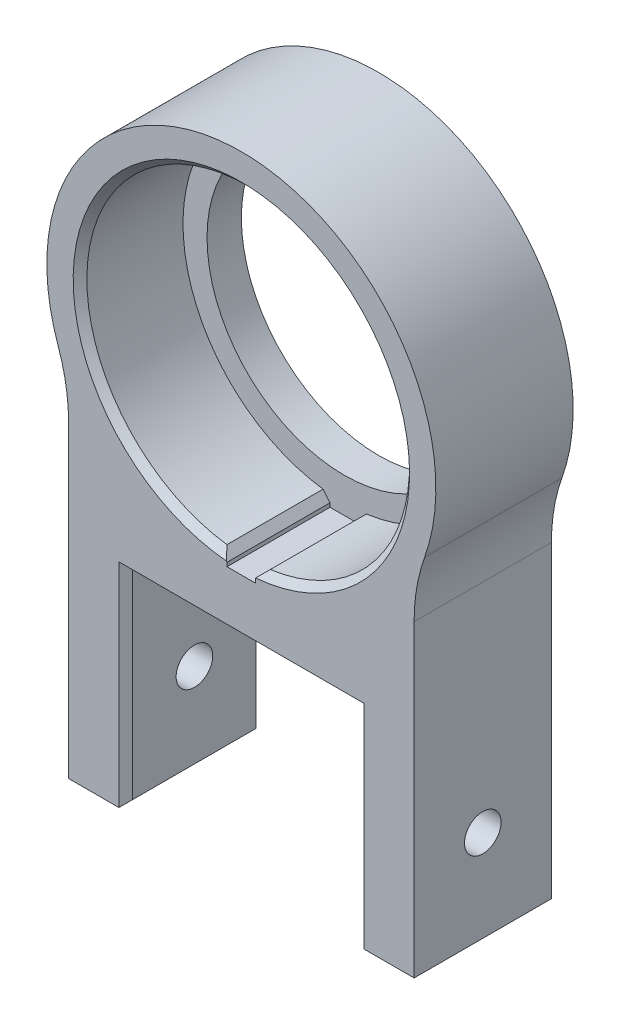
ISO-10303-21;
HEADER;
FILE_DESCRIPTION(('STEP AP214'),'2;1');
FILE_NAME('part.step','',(''),(''),'','','');
FILE_SCHEMA(('AUTOMOTIVE_DESIGN { 1 0 10303 214 1 1 1 1 }'));
ENDSEC;
DATA;
#1=APPLICATION_CONTEXT('core data for automotive mechanical design processes');
#2=APPLICATION_PROTOCOL_DEFINITION('international standard','automotive_design',2000,#1);
#3=PRODUCT_CONTEXT('',#1,'mechanical');
#4=PRODUCT('Part','Part','',(#3));
#5=PRODUCT_RELATED_PRODUCT_CATEGORY('part','',(#4));
#6=PRODUCT_DEFINITION_FORMATION('','',#4);
#7=PRODUCT_DEFINITION_CONTEXT('part definition',#1,'design');
#8=PRODUCT_DEFINITION('design','',#6,#7);
#9=PRODUCT_DEFINITION_SHAPE('','',#8);
#10=(LENGTH_UNIT() NAMED_UNIT(*) SI_UNIT(.MILLI.,.METRE.));
#11=(NAMED_UNIT(*) PLANE_ANGLE_UNIT() SI_UNIT($,.RADIAN.));
#12=(NAMED_UNIT(*) SI_UNIT($,.STERADIAN.) SOLID_ANGLE_UNIT());
#13=UNCERTAINTY_MEASURE_WITH_UNIT(LENGTH_MEASURE(1.E-05),#10,'distance_accuracy_value','');
#14=(GEOMETRIC_REPRESENTATION_CONTEXT(3) GLOBAL_UNCERTAINTY_ASSIGNED_CONTEXT((#13)) GLOBAL_UNIT_ASSIGNED_CONTEXT((#10,
#11,#12)) REPRESENTATION_CONTEXT('',''));
#15=CARTESIAN_POINT('',(0.,0.,0.));
#16=DIRECTION('',(0.,0.,1.));
#17=DIRECTION('',(1.,0.,0.));
#18=AXIS2_PLACEMENT_3D('',#15,#16,#17);
#19=CARTESIAN_POINT('',(-31.0633254055535,-11.0295347381974,12.));
#20=DIRECTION('',(0.,0.,-1.));
#21=DIRECTION('',(-1.,0.,0.));
#22=AXIS2_PLACEMENT_3D('',#19,#20,#21);
#23=PLANE('',#22);
#24=DIRECTION('',(0.,-1.,0.));
#25=VECTOR('',#24,1.);
#26=CARTESIAN_POINT('',(-1.25,-15.0444829025493,12.));
#27=LINE('',#26,#25);
#28=CARTESIAN_POINT('',(-1.25,-14.7057054048135,12.));
#29=VERTEX_POINT('',#28);
#30=CARTESIAN_POINT('',(-1.25,-15.0444829025493,12.));
#31=VERTEX_POINT('',#30);
#32=EDGE_CURVE('E212',#29,#31,#27,.T.);
#33=ORIENTED_EDGE('',*,*,#32,.F.);
#34=DIRECTION('',(0.641635859728227,-0.767009402491795,0.));
#35=VECTOR('',#34,1.);
#36=CARTESIAN_POINT('',(-1.25,-14.7057054048135,12.));
#37=LINE('',#36,#35);
#38=CARTESIAN_POINT('',(-1.30319148936173,-14.6421204728705,12.));
#39=VERTEX_POINT('',#38);
#40=EDGE_CURVE('E346',#29,#39,#37,.F.);
#41=ORIENTED_EDGE('',*,*,#40,.T.);
#42=CARTESIAN_POINT('',(0.,0.,12.));
#43=DIRECTION('',(0.,0.,-1.));
#44=DIRECTION('',(-1.,0.,0.));
#45=AXIS2_PLACEMENT_3D('',#42,#43,#44);
#46=CIRCLE('',#45,14.7);
#47=CARTESIAN_POINT('',(1.25,-14.6467573203081,12.));
#48=VERTEX_POINT('',#47);
#49=EDGE_CURVE('E216',#39,#48,#46,.T.);
#50=ORIENTED_EDGE('',*,*,#49,.T.);
#51=DIRECTION('',(0.,1.,0.));
#52=VECTOR('',#51,1.);
#53=CARTESIAN_POINT('',(1.25,-15.0444829025493,12.));
#54=LINE('',#53,#52);
#55=CARTESIAN_POINT('',(1.25,-15.0444829025493,12.));
#56=VERTEX_POINT('',#55);
#57=EDGE_CURVE('E192',#56,#48,#54,.T.);
#58=ORIENTED_EDGE('',*,*,#57,.F.);
#59=DIRECTION('',(1.,0.,0.));
#60=VECTOR('',#59,1.);
#61=CARTESIAN_POINT('',(-1.25,-15.0444829025493,12.));
#62=LINE('',#61,#60);
#63=EDGE_CURVE('E204',#31,#56,#62,.T.);
#64=ORIENTED_EDGE('',*,*,#63,.F.);
#65=EDGE_LOOP('',(#33,#41,#50,#58,#64));
#66=FACE_BOUND('',#65,.T.);
#67=DIRECTION('',(1.,0.,0.));
#68=VECTOR('',#67,1.);
#69=CARTESIAN_POINT('',(-15.1,-38.,12.));
#70=LINE('',#69,#68);
#71=CARTESIAN_POINT('',(-15.1,-38.,12.));
#72=VERTEX_POINT('',#71);
#73=CARTESIAN_POINT('',(-10.7,-38.,12.));
#74=VERTEX_POINT('',#73);
#75=EDGE_CURVE('E266',#72,#74,#70,.T.);
#76=ORIENTED_EDGE('',*,*,#75,.T.);
#77=DIRECTION('',(0.,1.,0.));
#78=VECTOR('',#77,1.);
#79=CARTESIAN_POINT('',(-10.7,-11.0295347381974,12.));
#80=LINE('',#79,#78);
#81=CARTESIAN_POINT('',(-10.7,-19.4,12.));
#82=VERTEX_POINT('',#81);
#83=EDGE_CURVE('E355',#74,#82,#80,.T.);
#84=ORIENTED_EDGE('',*,*,#83,.T.);
#85=DIRECTION('',(1.,0.,0.));
#86=VECTOR('',#85,1.);
#87=CARTESIAN_POINT('',(-31.0633254055535,-19.4,12.));
#88=LINE('',#87,#86);
#89=CARTESIAN_POINT('',(10.7,-19.4,12.));
#90=VERTEX_POINT('',#89);
#91=EDGE_CURVE('E352',#82,#90,#88,.T.);
#92=ORIENTED_EDGE('',*,*,#91,.T.);
#93=DIRECTION('',(0.,-1.,0.));
#94=VECTOR('',#93,1.);
#95=CARTESIAN_POINT('',(10.7,-11.0295347381974,12.));
#96=LINE('',#95,#94);
#97=CARTESIAN_POINT('',(10.7,-38.,12.));
#98=VERTEX_POINT('',#97);
#99=EDGE_CURVE('E349',#90,#98,#96,.T.);
#100=ORIENTED_EDGE('',*,*,#99,.T.);
#101=DIRECTION('',(1.,0.,0.));
#102=VECTOR('',#101,1.);
#103=CARTESIAN_POINT('',(10.1,-38.,12.));
#104=LINE('',#103,#102);
#105=CARTESIAN_POINT('',(15.1,-38.,12.));
#106=VERTEX_POINT('',#105);
#107=EDGE_CURVE('E270',#98,#106,#104,.T.);
#108=ORIENTED_EDGE('',*,*,#107,.T.);
#109=DIRECTION('',(0.,1.,0.));
#110=VECTOR('',#109,1.);
#111=CARTESIAN_POINT('',(15.1,-38.,12.));
#112=LINE('',#111,#110);
#113=CARTESIAN_POINT('',(15.1,-11.0295347381974,12.));
#114=VERTEX_POINT('',#113);
#115=EDGE_CURVE('E273',#106,#114,#112,.T.);
#116=ORIENTED_EDGE('',*,*,#115,.T.);
#117=CARTESIAN_POINT('',(31.0633254055536,-11.0295347381974,12.));
#118=DIRECTION('',(0.,0.,-1.));
#119=DIRECTION('',(-1.,0.,0.));
#120=AXIS2_PLACEMENT_3D('',#117,#118,#119);
#121=CIRCLE('',#120,15.9633254055536);
#122=CARTESIAN_POINT('',(16.020123133737,-5.68820312400177,12.));
#123=VERTEX_POINT('',#122);
#124=EDGE_CURVE('E276',#114,#123,#121,.T.);
#125=ORIENTED_EDGE('',*,*,#124,.T.);
#126=CARTESIAN_POINT('',(0.,0.,12.));
#127=DIRECTION('',(0.,0.,1.));
#128=DIRECTION('',(-1.,0.,0.));
#129=AXIS2_PLACEMENT_3D('',#126,#127,#128);
#130=CIRCLE('',#129,17.);
#131=CARTESIAN_POINT('',(-16.020123133737,-5.68820312400176,12.));
#132=VERTEX_POINT('',#131);
#133=EDGE_CURVE('E279',#123,#132,#130,.T.);
#134=ORIENTED_EDGE('',*,*,#133,.T.);
#135=CARTESIAN_POINT('',(-31.0633254055535,-11.0295347381974,12.));
#136=DIRECTION('',(0.,0.,-1.));
#137=DIRECTION('',(-1.,0.,0.));
#138=AXIS2_PLACEMENT_3D('',#135,#136,#137);
#139=CIRCLE('',#138,15.9633254055535);
#140=CARTESIAN_POINT('',(-15.1,-11.0295347381974,12.));
#141=VERTEX_POINT('',#140);
#142=EDGE_CURVE('E258',#132,#141,#139,.T.);
#143=ORIENTED_EDGE('',*,*,#142,.T.);
#144=DIRECTION('',(0.,-1.,0.));
#145=VECTOR('',#144,1.);
#146=CARTESIAN_POINT('',(-15.1,-38.,12.));
#147=LINE('',#146,#145);
#148=EDGE_CURVE('E262',#141,#72,#147,.T.);
#149=ORIENTED_EDGE('',*,*,#148,.T.);
#150=EDGE_LOOP('',(#76,#84,#92,#100,#108,#116,#125,#134,#143,#149));
#151=FACE_BOUND('',#150,.T.);
#152=ADVANCED_FACE('F43',(#66,#151),#23,.F.);
#153=CARTESIAN_POINT('',(-31.0633254055535,-11.0295347381974,0.));
#154=DIRECTION('',(0.,0.,-1.));
#155=DIRECTION('',(-1.,0.,0.));
#156=AXIS2_PLACEMENT_3D('',#153,#154,#155);
#157=PLANE('',#156);
#158=CARTESIAN_POINT('',(0.,0.,0.));
#159=DIRECTION('',(0.,0.,1.));
#160=DIRECTION('',(1.,0.,0.));
#161=AXIS2_PLACEMENT_3D('',#158,#159,#160);
#162=CIRCLE('',#161,12.);
#163=CARTESIAN_POINT('',(12.,0.,0.));
#164=VERTEX_POINT('',#163);
#165=EDGE_CURVE('E253',#164,#164,#162,.T.);
#166=ORIENTED_EDGE('',*,*,#165,.T.);
#167=EDGE_LOOP('',(#166));
#168=FACE_BOUND('',#167,.T.);
#169=DIRECTION('',(-1.,0.,0.));
#170=VECTOR('',#169,1.);
#171=CARTESIAN_POINT('',(-10.1,-19.4,0.));
#172=LINE('',#171,#170);
#173=CARTESIAN_POINT('',(10.7,-19.4,0.));
#174=VERTEX_POINT('',#173);
#175=CARTESIAN_POINT('',(-10.7,-19.4,0.));
#176=VERTEX_POINT('',#175);
#177=EDGE_CURVE('E627',#174,#176,#172,.T.);
#178=ORIENTED_EDGE('',*,*,#177,.T.);
#179=DIRECTION('',(0.,-1.,0.));
#180=VECTOR('',#179,1.);
#181=CARTESIAN_POINT('',(-10.7,-38.,0.));
#182=LINE('',#181,#180);
#183=CARTESIAN_POINT('',(-10.7,-38.,0.));
#184=VERTEX_POINT('',#183);
#185=EDGE_CURVE('E608',#176,#184,#182,.T.);
#186=ORIENTED_EDGE('',*,*,#185,.T.);
#187=DIRECTION('',(1.,0.,0.));
#188=VECTOR('',#187,1.);
#189=CARTESIAN_POINT('',(-15.1,-38.,0.));
#190=LINE('',#189,#188);
#191=CARTESIAN_POINT('',(-15.1,-38.,0.));
#192=VERTEX_POINT('',#191);
#193=EDGE_CURVE('E289',#192,#184,#190,.T.);
#194=ORIENTED_EDGE('',*,*,#193,.F.);
#195=DIRECTION('',(0.,-1.,0.));
#196=VECTOR('',#195,1.);
#197=CARTESIAN_POINT('',(-15.1,-38.,0.));
#198=LINE('',#197,#196);
#199=CARTESIAN_POINT('',(-15.1,-11.0295347381974,0.));
#200=VERTEX_POINT('',#199);
#201=EDGE_CURVE('E286',#200,#192,#198,.T.);
#202=ORIENTED_EDGE('',*,*,#201,.F.);
#203=CARTESIAN_POINT('',(-31.0633254055535,-11.0295347381974,0.));
#204=DIRECTION('',(0.,0.,-1.));
#205=DIRECTION('',(-1.,0.,0.));
#206=AXIS2_PLACEMENT_3D('',#203,#204,#205);
#207=CIRCLE('',#206,15.9633254055535);
#208=CARTESIAN_POINT('',(-16.020123133737,-5.68820312400176,0.));
#209=VERTEX_POINT('',#208);
#210=EDGE_CURVE('E257',#209,#200,#207,.T.);
#211=ORIENTED_EDGE('',*,*,#210,.F.);
#212=CARTESIAN_POINT('',(0.,0.,0.));
#213=DIRECTION('',(0.,0.,1.));
#214=DIRECTION('',(-1.,0.,0.));
#215=AXIS2_PLACEMENT_3D('',#212,#213,#214);
#216=CIRCLE('',#215,17.);
#217=CARTESIAN_POINT('',(16.020123133737,-5.68820312400177,0.));
#218=VERTEX_POINT('',#217);
#219=EDGE_CURVE('E263',#218,#209,#216,.T.);
#220=ORIENTED_EDGE('',*,*,#219,.F.);
#221=CARTESIAN_POINT('',(31.0633254055536,-11.0295347381974,0.));
#222=DIRECTION('',(0.,0.,-1.));
#223=DIRECTION('',(-1.,0.,0.));
#224=AXIS2_PLACEMENT_3D('',#221,#222,#223);
#225=CIRCLE('',#224,15.9633254055536);
#226=CARTESIAN_POINT('',(15.1,-11.0295347381974,0.));
#227=VERTEX_POINT('',#226);
#228=EDGE_CURVE('E299',#227,#218,#225,.T.);
#229=ORIENTED_EDGE('',*,*,#228,.F.);
#230=DIRECTION('',(0.,1.,0.));
#231=VECTOR('',#230,1.);
#232=CARTESIAN_POINT('',(15.1,-38.,0.));
#233=LINE('',#232,#231);
#234=CARTESIAN_POINT('',(15.1,-38.,0.));
#235=VERTEX_POINT('',#234);
#236=EDGE_CURVE('E296',#235,#227,#233,.T.);
#237=ORIENTED_EDGE('',*,*,#236,.F.);
#238=DIRECTION('',(1.,0.,0.));
#239=VECTOR('',#238,1.);
#240=CARTESIAN_POINT('',(10.1,-38.,0.));
#241=LINE('',#240,#239);
#242=CARTESIAN_POINT('',(10.7,-38.,0.));
#243=VERTEX_POINT('',#242);
#244=EDGE_CURVE('E293',#243,#235,#241,.T.);
#245=ORIENTED_EDGE('',*,*,#244,.F.);
#246=DIRECTION('',(0.,1.,0.));
#247=VECTOR('',#246,1.);
#248=CARTESIAN_POINT('',(10.7,-20.,0.));
#249=LINE('',#248,#247);
#250=EDGE_CURVE('E622',#243,#174,#249,.T.);
#251=ORIENTED_EDGE('',*,*,#250,.T.);
#252=EDGE_LOOP('',(#178,#186,#194,#202,#211,#220,#229,#237,#245,#251));
#253=FACE_BOUND('',#252,.T.);
#254=ADVANCED_FACE('F413',(#168,#253),#157,.T.);
#255=CARTESIAN_POINT('',(-31.0633254055535,-11.0295347381974,12.));
#256=DIRECTION('',(0.,0.,-1.));
#257=DIRECTION('',(-1.,0.,0.));
#258=AXIS2_PLACEMENT_3D('',#255,#256,#257);
#259=CYLINDRICAL_SURFACE('',#258,15.9633254055535);
#260=ORIENTED_EDGE('',*,*,#210,.T.);
#261=DIRECTION('',(0.,0.,-1.));
#262=VECTOR('',#261,1.);
#263=CARTESIAN_POINT('',(-15.1,-11.0295347381974,12.));
#264=LINE('',#263,#262);
#265=EDGE_CURVE('E330',#141,#200,#264,.T.);
#266=ORIENTED_EDGE('',*,*,#265,.F.);
#267=ORIENTED_EDGE('',*,*,#142,.F.);
#268=DIRECTION('',(0.,0.,-1.));
#269=VECTOR('',#268,1.);
#270=CARTESIAN_POINT('',(-16.020123133737,-5.68820312400176,12.));
#271=LINE('',#270,#269);
#272=EDGE_CURVE('E282',#132,#209,#271,.T.);
#273=ORIENTED_EDGE('',*,*,#272,.T.);
#274=EDGE_LOOP('',(#260,#266,#267,#273));
#275=FACE_BOUND('',#274,.T.);
#276=ADVANCED_FACE('F416',(#275),#259,.F.);
#277=CARTESIAN_POINT('',(-15.1,-38.,12.));
#278=DIRECTION('',(1.,0.,0.));
#279=DIRECTION('',(0.,0.,-1.));
#280=AXIS2_PLACEMENT_3D('',#277,#278,#279);
#281=PLANE('',#280);
#282=CARTESIAN_POINT('',(-15.1,-30.,6.));
#283=DIRECTION('',(1.,0.,0.));
#284=DIRECTION('',(0.,0.,-1.));
#285=AXIS2_PLACEMENT_3D('',#282,#283,#284);
#286=CIRCLE('',#285,1.6);
#287=CARTESIAN_POINT('',(-15.1,-31.6,6.));
#288=VERTEX_POINT('',#287);
#289=EDGE_CURVE('E244',#288,#288,#286,.T.);
#290=ORIENTED_EDGE('',*,*,#289,.T.);
#291=EDGE_LOOP('',(#290));
#292=FACE_BOUND('',#291,.T.);
#293=ORIENTED_EDGE('',*,*,#201,.T.);
#294=DIRECTION('',(0.,0.,-1.));
#295=VECTOR('',#294,1.);
#296=CARTESIAN_POINT('',(-15.1,-38.,12.));
#297=LINE('',#296,#295);
#298=EDGE_CURVE('E326',#72,#192,#297,.T.);
#299=ORIENTED_EDGE('',*,*,#298,.F.);
#300=ORIENTED_EDGE('',*,*,#148,.F.);
#301=ORIENTED_EDGE('',*,*,#265,.T.);
#302=EDGE_LOOP('',(#293,#299,#300,#301));
#303=FACE_BOUND('',#302,.T.);
#304=ADVANCED_FACE('F448',(#292,#303),#281,.F.);
#305=CARTESIAN_POINT('',(-15.1,-38.,12.));
#306=DIRECTION('',(0.,1.,0.));
#307=DIRECTION('',(0.,0.,1.));
#308=AXIS2_PLACEMENT_3D('',#305,#306,#307);
#309=PLANE('',#308);
#310=ORIENTED_EDGE('',*,*,#193,.T.);
#311=DIRECTION('',(0.,0.,1.));
#312=VECTOR('',#311,1.);
#313=CARTESIAN_POINT('',(-10.7,-38.,12.));
#314=LINE('',#313,#312);
#315=EDGE_CURVE('E485',#184,#74,#314,.T.);
#316=ORIENTED_EDGE('',*,*,#315,.T.);
#317=ORIENTED_EDGE('',*,*,#75,.F.);
#318=ORIENTED_EDGE('',*,*,#298,.T.);
#319=EDGE_LOOP('',(#310,#316,#317,#318));
#320=FACE_BOUND('',#319,.T.);
#321=ADVANCED_FACE('F444',(#320),#309,.F.);
#322=CARTESIAN_POINT('',(-10.1,-38.,12.));
#323=DIRECTION('',(-1.,0.,0.));
#324=DIRECTION('',(0.,0.,1.));
#325=AXIS2_PLACEMENT_3D('',#322,#323,#324);
#326=PLANE('',#325);
#327=CARTESIAN_POINT('',(-10.1,-30.,6.));
#328=DIRECTION('',(-1.,0.,0.));
#329=DIRECTION('',(0.,0.,1.));
#330=AXIS2_PLACEMENT_3D('',#327,#328,#329);
#331=CIRCLE('',#330,1.6);
#332=CARTESIAN_POINT('',(-10.1,-31.6,6.));
#333=VERTEX_POINT('',#332);
#334=EDGE_CURVE('E240',#333,#333,#331,.T.);
#335=ORIENTED_EDGE('',*,*,#334,.T.);
#336=EDGE_LOOP('',(#335));
#337=FACE_BOUND('',#336,.T.);
#338=DIRECTION('',(0.,0.,-1.));
#339=VECTOR('',#338,1.);
#340=CARTESIAN_POINT('',(-10.1,-37.4,12.));
#341=LINE('',#340,#339);
#342=CARTESIAN_POINT('',(-10.1,-37.4,11.4));
#343=VERTEX_POINT('',#342);
#344=CARTESIAN_POINT('',(-10.1,-37.4,0.599999999999989));
#345=VERTEX_POINT('',#344);
#346=EDGE_CURVE('E619',#343,#345,#341,.T.);
#347=ORIENTED_EDGE('',*,*,#346,.T.);
#348=DIRECTION('',(0.,1.,0.));
#349=VECTOR('',#348,1.);
#350=CARTESIAN_POINT('',(-10.1,-20.,0.599999999999989));
#351=LINE('',#350,#349);
#352=CARTESIAN_POINT('',(-10.1,-20.,0.599999999999989));
#353=VERTEX_POINT('',#352);
#354=EDGE_CURVE('E607',#345,#353,#351,.T.);
#355=ORIENTED_EDGE('',*,*,#354,.T.);
#356=DIRECTION('',(0.,0.,-1.));
#357=VECTOR('',#356,1.);
#358=CARTESIAN_POINT('',(-10.1,-20.,12.));
#359=LINE('',#358,#357);
#360=CARTESIAN_POINT('',(-10.1,-20.,11.4));
#361=VERTEX_POINT('',#360);
#362=EDGE_CURVE('E322',#361,#353,#359,.T.);
#363=ORIENTED_EDGE('',*,*,#362,.F.);
#364=DIRECTION('',(0.,-1.,0.));
#365=VECTOR('',#364,1.);
#366=CARTESIAN_POINT('',(-10.1,-38.,11.4));
#367=LINE('',#366,#365);
#368=EDGE_CURVE('E638',#361,#343,#367,.T.);
#369=ORIENTED_EDGE('',*,*,#368,.T.);
#370=EDGE_LOOP('',(#347,#355,#363,#369));
#371=FACE_BOUND('',#370,.T.);
#372=ADVANCED_FACE('F440',(#337,#371),#326,.F.);
#373=CARTESIAN_POINT('',(-10.1,-20.,12.));
#374=DIRECTION('',(0.,1.,0.));
#375=DIRECTION('',(0.,0.,1.));
#376=AXIS2_PLACEMENT_3D('',#373,#374,#375);
#377=PLANE('',#376);
#378=ORIENTED_EDGE('',*,*,#362,.T.);
#379=DIRECTION('',(1.,0.,0.));
#380=VECTOR('',#379,1.);
#381=CARTESIAN_POINT('',(10.1,-20.,0.599999999999989));
#382=LINE('',#381,#380);
#383=CARTESIAN_POINT('',(10.1,-20.,0.599999999999996));
#384=VERTEX_POINT('',#383);
#385=EDGE_CURVE('E610',#353,#384,#382,.T.);
#386=ORIENTED_EDGE('',*,*,#385,.T.);
#387=DIRECTION('',(0.,0.,-1.));
#388=VECTOR('',#387,1.);
#389=CARTESIAN_POINT('',(10.1,-20.,12.));
#390=LINE('',#389,#388);
#391=CARTESIAN_POINT('',(10.1,-20.,11.4));
#392=VERTEX_POINT('',#391);
#393=EDGE_CURVE('E319',#392,#384,#390,.T.);
#394=ORIENTED_EDGE('',*,*,#393,.F.);
#395=DIRECTION('',(-1.,0.,0.));
#396=VECTOR('',#395,1.);
#397=CARTESIAN_POINT('',(-10.1,-20.,11.4));
#398=LINE('',#397,#396);
#399=EDGE_CURVE('E577',#392,#361,#398,.T.);
#400=ORIENTED_EDGE('',*,*,#399,.T.);
#401=EDGE_LOOP('',(#378,#386,#394,#400));
#402=FACE_BOUND('',#401,.T.);
#403=ADVANCED_FACE('F436',(#402),#377,.F.);
#404=CARTESIAN_POINT('',(10.1,-20.,12.));
#405=DIRECTION('',(1.,0.,0.));
#406=DIRECTION('',(0.,1.,0.));
#407=AXIS2_PLACEMENT_3D('',#404,#405,#406);
#408=PLANE('',#407);
#409=CARTESIAN_POINT('',(10.1,-30.,6.));
#410=DIRECTION('',(1.,0.,0.));
#411=DIRECTION('',(0.,1.,0.));
#412=AXIS2_PLACEMENT_3D('',#409,#410,#411);
#413=CIRCLE('',#412,1.6);
#414=CARTESIAN_POINT('',(10.1,-31.6,6.));
#415=VERTEX_POINT('',#414);
#416=EDGE_CURVE('E236',#415,#415,#413,.T.);
#417=ORIENTED_EDGE('',*,*,#416,.T.);
#418=EDGE_LOOP('',(#417));
#419=FACE_BOUND('',#418,.T.);
#420=ORIENTED_EDGE('',*,*,#393,.T.);
#421=DIRECTION('',(0.,-1.,0.));
#422=VECTOR('',#421,1.);
#423=CARTESIAN_POINT('',(10.1,-38.,0.599999999999996));
#424=LINE('',#423,#422);
#425=CARTESIAN_POINT('',(10.1,-37.4,0.599999999999996));
#426=VERTEX_POINT('',#425);
#427=EDGE_CURVE('E62',#384,#426,#424,.T.);
#428=ORIENTED_EDGE('',*,*,#427,.T.);
#429=DIRECTION('',(0.,0.,1.));
#430=VECTOR('',#429,1.);
#431=CARTESIAN_POINT('',(10.1,-37.4,12.));
#432=LINE('',#431,#430);
#433=CARTESIAN_POINT('',(10.1,-37.4,11.4));
#434=VERTEX_POINT('',#433);
#435=EDGE_CURVE('E66',#426,#434,#432,.T.);
#436=ORIENTED_EDGE('',*,*,#435,.T.);
#437=DIRECTION('',(0.,1.,0.));
#438=VECTOR('',#437,1.);
#439=CARTESIAN_POINT('',(10.1,-20.,11.4));
#440=LINE('',#439,#438);
#441=EDGE_CURVE('E614',#434,#392,#440,.T.);
#442=ORIENTED_EDGE('',*,*,#441,.T.);
#443=EDGE_LOOP('',(#420,#428,#436,#442));
#444=FACE_BOUND('',#443,.T.);
#445=ADVANCED_FACE('F432',(#419,#444),#408,.F.);
#446=CARTESIAN_POINT('',(10.1,-38.,12.));
#447=DIRECTION('',(0.,1.,0.));
#448=DIRECTION('',(0.,0.,1.));
#449=AXIS2_PLACEMENT_3D('',#446,#447,#448);
#450=PLANE('',#449);
#451=ORIENTED_EDGE('',*,*,#107,.F.);
#452=DIRECTION('',(0.,0.,-1.));
#453=VECTOR('',#452,1.);
#454=CARTESIAN_POINT('',(10.7,-38.,12.));
#455=LINE('',#454,#453);
#456=EDGE_CURVE('E481',#98,#243,#455,.T.);
#457=ORIENTED_EDGE('',*,*,#456,.T.);
#458=ORIENTED_EDGE('',*,*,#244,.T.);
#459=DIRECTION('',(0.,0.,-1.));
#460=VECTOR('',#459,1.);
#461=CARTESIAN_POINT('',(15.1,-38.,12.));
#462=LINE('',#461,#460);
#463=EDGE_CURVE('E315',#106,#235,#462,.T.);
#464=ORIENTED_EDGE('',*,*,#463,.F.);
#465=EDGE_LOOP('',(#451,#457,#458,#464));
#466=FACE_BOUND('',#465,.T.);
#467=ADVANCED_FACE('F428',(#466),#450,.F.);
#468=CARTESIAN_POINT('',(15.1,-38.,12.));
#469=DIRECTION('',(-1.,0.,0.));
#470=DIRECTION('',(0.,-1.,0.));
#471=AXIS2_PLACEMENT_3D('',#468,#469,#470);
#472=PLANE('',#471);
#473=CARTESIAN_POINT('',(15.1,-30.,6.));
#474=DIRECTION('',(-1.,0.,0.));
#475=DIRECTION('',(0.,-1.,0.));
#476=AXIS2_PLACEMENT_3D('',#473,#474,#475);
#477=CIRCLE('',#476,1.6);
#478=CARTESIAN_POINT('',(15.1,-31.6,6.));
#479=VERTEX_POINT('',#478);
#480=EDGE_CURVE('E229',#479,#479,#477,.T.);
#481=ORIENTED_EDGE('',*,*,#480,.T.);
#482=EDGE_LOOP('',(#481));
#483=FACE_BOUND('',#482,.T.);
#484=ORIENTED_EDGE('',*,*,#236,.T.);
#485=DIRECTION('',(0.,0.,-1.));
#486=VECTOR('',#485,1.);
#487=CARTESIAN_POINT('',(15.1,-11.0295347381974,12.));
#488=LINE('',#487,#486);
#489=EDGE_CURVE('E311',#114,#227,#488,.T.);
#490=ORIENTED_EDGE('',*,*,#489,.F.);
#491=ORIENTED_EDGE('',*,*,#115,.F.);
#492=ORIENTED_EDGE('',*,*,#463,.T.);
#493=EDGE_LOOP('',(#484,#490,#491,#492));
#494=FACE_BOUND('',#493,.T.);
#495=ADVANCED_FACE('F424',(#483,#494),#472,.F.);
#496=CARTESIAN_POINT('',(31.0633254055536,-11.0295347381974,12.));
#497=DIRECTION('',(0.,0.,-1.));
#498=DIRECTION('',(-1.,0.,0.));
#499=AXIS2_PLACEMENT_3D('',#496,#497,#498);
#500=CYLINDRICAL_SURFACE('',#499,15.9633254055536);
#501=ORIENTED_EDGE('',*,*,#228,.T.);
#502=DIRECTION('',(0.,0.,-1.));
#503=VECTOR('',#502,1.);
#504=CARTESIAN_POINT('',(16.020123133737,-5.68820312400177,12.));
#505=LINE('',#504,#503);
#506=EDGE_CURVE('E307',#123,#218,#505,.T.);
#507=ORIENTED_EDGE('',*,*,#506,.F.);
#508=ORIENTED_EDGE('',*,*,#124,.F.);
#509=ORIENTED_EDGE('',*,*,#489,.T.);
#510=EDGE_LOOP('',(#501,#507,#508,#509));
#511=FACE_BOUND('',#510,.T.);
#512=ADVANCED_FACE('F420',(#511),#500,.F.);
#513=CARTESIAN_POINT('',(0.,0.,12.));
#514=DIRECTION('',(0.,0.,-1.));
#515=DIRECTION('',(-1.,0.,0.));
#516=AXIS2_PLACEMENT_3D('',#513,#514,#515);
#517=CYLINDRICAL_SURFACE('',#516,17.);
#518=ORIENTED_EDGE('',*,*,#219,.T.);
#519=ORIENTED_EDGE('',*,*,#272,.F.);
#520=ORIENTED_EDGE('',*,*,#133,.F.);
#521=ORIENTED_EDGE('',*,*,#506,.T.);
#522=EDGE_LOOP('',(#518,#519,#520,#521));
#523=FACE_BOUND('',#522,.T.);
#524=ADVANCED_FACE('F409',(#523),#517,.T.);
#525=CARTESIAN_POINT('',(0.,0.,12.));
#526=DIRECTION('',(0.,0.,-1.));
#527=DIRECTION('',(-1.,0.,0.));
#528=AXIS2_PLACEMENT_3D('',#525,#526,#527);
#529=CYLINDRICAL_SURFACE('',#528,12.);
#530=CARTESIAN_POINT('',(0.,0.,3.));
#531=DIRECTION('',(0.,0.,-1.));
#532=DIRECTION('',(-1.,0.,0.));
#533=AXIS2_PLACEMENT_3D('',#530,#531,#532);
#534=CIRCLE('',#533,12.);
#535=CARTESIAN_POINT('',(-12.,0.,3.));
#536=VERTEX_POINT('',#535);
#537=EDGE_CURVE('E252',#536,#536,#534,.T.);
#538=ORIENTED_EDGE('',*,*,#537,.F.);
#539=EDGE_LOOP('',(#538));
#540=FACE_BOUND('',#539,.T.);
#541=ORIENTED_EDGE('',*,*,#165,.F.);
#542=EDGE_LOOP('',(#541));
#543=FACE_BOUND('',#542,.T.);
#544=ADVANCED_FACE('F405',(#540,#543),#529,.F.);
#545=CARTESIAN_POINT('',(-31.0633254055535,-11.0295347381974,3.));
#546=DIRECTION('',(0.,0.,-1.));
#547=DIRECTION('',(-1.,0.,0.));
#548=AXIS2_PLACEMENT_3D('',#545,#546,#547);
#549=PLANE('',#548);
#550=ORIENTED_EDGE('',*,*,#537,.T.);
#551=EDGE_LOOP('',(#550));
#552=FACE_BOUND('',#551,.T.);
#553=DIRECTION('',(0.,1.,0.));
#554=VECTOR('',#553,1.);
#555=CARTESIAN_POINT('',(1.25,-15.0444829025493,3.));
#556=LINE('',#555,#554);
#557=CARTESIAN_POINT('',(1.25,-15.0444829025493,3.));
#558=VERTEX_POINT('',#557);
#559=CARTESIAN_POINT('',(1.25,-14.6444829025493,3.));
#560=VERTEX_POINT('',#559);
#561=EDGE_CURVE('E195',#558,#560,#556,.T.);
#562=ORIENTED_EDGE('',*,*,#561,.T.);
#563=DIRECTION('',(-0.707106781186544,-0.707106781186552,0.));
#564=VECTOR('',#563,1.);
#565=CARTESIAN_POINT('',(-13.0991886206006,-28.9936715231501,3.));
#566=LINE('',#565,#564);
#567=CARTESIAN_POINT('',(1.92674701018914,-13.9677358923602,3.));
#568=VERTEX_POINT('',#567);
#569=EDGE_CURVE('E12',#560,#568,#566,.F.);
#570=ORIENTED_EDGE('',*,*,#569,.T.);
#571=CARTESIAN_POINT('',(0.,0.,3.));
#572=DIRECTION('',(0.,0.,-1.));
#573=DIRECTION('',(-1.,0.,0.));
#574=AXIS2_PLACEMENT_3D('',#571,#572,#573);
#575=CIRCLE('',#574,14.1);
#576=CARTESIAN_POINT('',(-1.85974834521651,-13.9768142325948,3.));
#577=VERTEX_POINT('',#576);
#578=EDGE_CURVE('E248',#568,#577,#575,.F.);
#579=ORIENTED_EDGE('',*,*,#578,.T.);
#580=DIRECTION('',(-0.641635859728227,0.767009402491795,0.));
#581=VECTOR('',#580,1.);
#582=CARTESIAN_POINT('',(-15.3332373458549,2.12935033282808,3.));
#583=LINE('',#582,#581);
#584=CARTESIAN_POINT('',(-1.25,-14.7057054048135,3.));
#585=VERTEX_POINT('',#584);
#586=EDGE_CURVE('E54',#577,#585,#583,.F.);
#587=ORIENTED_EDGE('',*,*,#586,.T.);
#588=DIRECTION('',(0.,-1.,0.));
#589=VECTOR('',#588,1.);
#590=CARTESIAN_POINT('',(-1.25,-15.0444829025493,3.));
#591=LINE('',#590,#589);
#592=CARTESIAN_POINT('',(-1.25,-15.0444829025493,3.));
#593=VERTEX_POINT('',#592);
#594=EDGE_CURVE('E211',#585,#593,#591,.T.);
#595=ORIENTED_EDGE('',*,*,#594,.T.);
#596=DIRECTION('',(1.,0.,0.));
#597=VECTOR('',#596,1.);
#598=CARTESIAN_POINT('',(-1.25,-15.0444829025493,3.));
#599=LINE('',#598,#597);
#600=EDGE_CURVE('E200',#593,#558,#599,.T.);
#601=ORIENTED_EDGE('',*,*,#600,.T.);
#602=EDGE_LOOP('',(#562,#570,#579,#587,#595,#601));
#603=FACE_BOUND('',#602,.T.);
#604=ADVANCED_FACE('F401',(#552,#603),#549,.F.);
#605=CARTESIAN_POINT('',(0.,0.,-39.8808224589213));
#606=DIRECTION('',(0.,0.,1.));
#607=DIRECTION('',(1.,0.,0.));
#608=AXIS2_PLACEMENT_3D('',#605,#606,#607);
#609=CYLINDRICAL_SURFACE('',#608,14.1);
#610=CARTESIAN_POINT('',(0.,0.,11.4));
#611=DIRECTION('',(0.,0.,-1.));
#612=DIRECTION('',(-1.,0.,0.));
#613=AXIS2_PLACEMENT_3D('',#610,#611,#612);
#614=CIRCLE('',#613,14.1);
#615=CARTESIAN_POINT('',(1.92674701018914,-13.9677358923602,11.4));
#616=VERTEX_POINT('',#615);
#617=CARTESIAN_POINT('',(-1.85974834521651,-13.9768142325948,11.4));
#618=VERTEX_POINT('',#617);
#619=EDGE_CURVE('E358',#616,#618,#614,.F.);
#620=ORIENTED_EDGE('',*,*,#619,.T.);
#621=DIRECTION('',(0.,0.,1.));
#622=VECTOR('',#621,1.);
#623=CARTESIAN_POINT('',(-1.85974834521651,-13.9768142325948,-39.8808224589213));
#624=LINE('',#623,#622);
#625=EDGE_CURVE('E364',#618,#577,#624,.F.);
#626=ORIENTED_EDGE('',*,*,#625,.T.);
#627=ORIENTED_EDGE('',*,*,#578,.F.);
#628=DIRECTION('',(0.,0.,1.));
#629=VECTOR('',#628,1.);
#630=CARTESIAN_POINT('',(1.92674701018914,-13.9677358923602,-39.8808224589213));
#631=LINE('',#630,#629);
#632=EDGE_CURVE('E361',#568,#616,#631,.T.);
#633=ORIENTED_EDGE('',*,*,#632,.T.);
#634=EDGE_LOOP('',(#620,#626,#627,#633));
#635=FACE_BOUND('',#634,.T.);
#636=ADVANCED_FACE('F398',(#635),#609,.F.);
#637=CARTESIAN_POINT('',(17.,-30.,6.));
#638=DIRECTION('',(-1.,0.,0.));
#639=DIRECTION('',(0.,-1.,0.));
#640=AXIS2_PLACEMENT_3D('',#637,#638,#639);
#641=CYLINDRICAL_SURFACE('',#640,1.6);
#642=CARTESIAN_POINT('',(15.1,-31.6,6.));
#643=CARTESIAN_POINT('',(15.0479166666667,-31.6,6.));
#644=CARTESIAN_POINT('',(14.9958333333333,-31.6,6.));
#645=CARTESIAN_POINT('',(14.8916666666667,-31.6,6.));
#646=CARTESIAN_POINT('',(14.8395833333333,-31.6,6.));
#647=CARTESIAN_POINT('',(14.7354166666667,-31.6,6.));
#648=CARTESIAN_POINT('',(14.6833333333333,-31.6,6.));
#649=CARTESIAN_POINT('',(14.5791666666667,-31.6,6.));
#650=CARTESIAN_POINT('',(14.5270833333333,-31.6,6.));
#651=CARTESIAN_POINT('',(14.4229166666667,-31.6,6.));
#652=CARTESIAN_POINT('',(14.3708333333333,-31.6,6.));
#653=CARTESIAN_POINT('',(14.2666666666667,-31.6,6.));
#654=CARTESIAN_POINT('',(14.2145833333333,-31.6,6.));
#655=CARTESIAN_POINT('',(14.1104166666667,-31.6,6.));
#656=CARTESIAN_POINT('',(14.0583333333333,-31.6,6.));
#657=CARTESIAN_POINT('',(13.9541666666667,-31.6,6.));
#658=CARTESIAN_POINT('',(13.9020833333333,-31.6,6.));
#659=CARTESIAN_POINT('',(13.7979166666667,-31.6,6.));
#660=CARTESIAN_POINT('',(13.7458333333333,-31.6,6.));
#661=CARTESIAN_POINT('',(13.6416666666667,-31.6,6.));
#662=CARTESIAN_POINT('',(13.5895833333333,-31.6,6.));
#663=CARTESIAN_POINT('',(13.4854166666667,-31.6,6.));
#664=CARTESIAN_POINT('',(13.4333333333333,-31.6,6.));
#665=CARTESIAN_POINT('',(13.3291666666667,-31.6,6.));
#666=CARTESIAN_POINT('',(13.2770833333333,-31.6,6.));
#667=CARTESIAN_POINT('',(13.1729166666667,-31.6,6.));
#668=CARTESIAN_POINT('',(13.1208333333333,-31.6,6.));
#669=CARTESIAN_POINT('',(13.0166666666667,-31.6,6.));
#670=CARTESIAN_POINT('',(12.9645833333333,-31.6,6.));
#671=CARTESIAN_POINT('',(12.8604166666667,-31.6,6.));
#672=CARTESIAN_POINT('',(12.8083333333333,-31.6,6.));
#673=CARTESIAN_POINT('',(12.7041666666667,-31.6,6.));
#674=CARTESIAN_POINT('',(12.6520833333333,-31.6,6.));
#675=CARTESIAN_POINT('',(12.5479166666667,-31.6,6.));
#676=CARTESIAN_POINT('',(12.4958333333333,-31.6,6.));
#677=CARTESIAN_POINT('',(12.3916666666667,-31.6,6.));
#678=CARTESIAN_POINT('',(12.3395833333333,-31.6,6.));
#679=CARTESIAN_POINT('',(12.2354166666667,-31.6,6.));
#680=CARTESIAN_POINT('',(12.1833333333333,-31.6,6.));
#681=CARTESIAN_POINT('',(12.0791666666667,-31.6,6.));
#682=CARTESIAN_POINT('',(12.0270833333333,-31.6,6.));
#683=CARTESIAN_POINT('',(11.9229166666667,-31.6,6.));
#684=CARTESIAN_POINT('',(11.8708333333333,-31.6,6.));
#685=CARTESIAN_POINT('',(11.7666666666667,-31.6,6.));
#686=CARTESIAN_POINT('',(11.7145833333333,-31.6,6.));
#687=CARTESIAN_POINT('',(11.6104166666667,-31.6,6.));
#688=CARTESIAN_POINT('',(11.5583333333333,-31.6,6.));
#689=CARTESIAN_POINT('',(11.4541666666667,-31.6,6.));
#690=CARTESIAN_POINT('',(11.4020833333333,-31.6,6.));
#691=CARTESIAN_POINT('',(11.2979166666667,-31.6,6.));
#692=CARTESIAN_POINT('',(11.2458333333333,-31.6,6.));
#693=CARTESIAN_POINT('',(11.1416666666667,-31.6,6.));
#694=CARTESIAN_POINT('',(11.0895833333333,-31.6,6.));
#695=CARTESIAN_POINT('',(10.9854166666667,-31.6,6.));
#696=CARTESIAN_POINT('',(10.9333333333333,-31.6,6.));
#697=CARTESIAN_POINT('',(10.8291666666667,-31.6,6.));
#698=CARTESIAN_POINT('',(10.7770833333333,-31.6,6.));
#699=CARTESIAN_POINT('',(10.6729166666667,-31.6,6.));
#700=CARTESIAN_POINT('',(10.6208333333333,-31.6,6.));
#701=CARTESIAN_POINT('',(10.5166666666667,-31.6,6.));
#702=CARTESIAN_POINT('',(10.4645833333333,-31.6,6.));
#703=CARTESIAN_POINT('',(10.3604166666667,-31.6,6.));
#704=CARTESIAN_POINT('',(10.3083333333333,-31.6,6.));
#705=CARTESIAN_POINT('',(10.2041666666667,-31.6,6.));
#706=CARTESIAN_POINT('',(10.1520833333333,-31.6,6.));
#707=CARTESIAN_POINT('',(10.1,-31.6,6.));
#708=B_SPLINE_CURVE_WITH_KNOTS('',3,(#642,#643,#644,#645,#646,#647,#648,#649,#650,#651,#652,
#653,#654,#655,#656,#657,#658,#659,#660,#661,#662,#663,#664,#665,#666,#667,#668,#669,#670,#671,
#672,#673,#674,#675,#676,#677,#678,#679,#680,#681,#682,#683,#684,#685,#686,#687,#688,#689,#690,
#691,#692,#693,#694,#695,#696,#697,#698,#699,#700,#701,#702,#703,#704,#705,#706,#707),
.UNSPECIFIED.,.F.,.F.,(4,2,2,2,2,2,2,2,2,2,2,2,2,2,2,2,2,2,2,2,2,2,2,2,2,2,2,2,2,2,2,2,4),(0.,
0.15625,0.3125,0.46875,0.625000000000001,0.781250000000001,0.937500000000001,1.09375,1.25,
1.40625,1.5625,1.71875,1.875,2.03125,2.1875,2.34375,2.5,2.65625,2.8125,2.96875,3.125,3.28125,
3.4375,3.59375,3.75,3.90625,4.0625,4.21875,4.375,4.53125,4.6875,4.84375,5.),.UNSPECIFIED.);
#709=EDGE_CURVE('BSEAM396',#479,#415,#708,.T.);
#710=ORIENTED_EDGE('',*,*,#480,.F.);
#711=ORIENTED_EDGE('',*,*,#416,.F.);
#712=ORIENTED_EDGE('',*,*,#709,.T.);
#713=ORIENTED_EDGE('',*,*,#709,.F.);
#714=EDGE_LOOP('',(#710,#712,#711,#713));
#715=FACE_BOUND('',#714,.T.);
#716=ADVANCED_FACE('F396',(#715),#641,.F.);
#717=CARTESIAN_POINT('',(-10.1,-31.6,6.));
#718=CARTESIAN_POINT('',(-10.1520833333333,-31.6,6.));
#719=CARTESIAN_POINT('',(-10.2041666666667,-31.6,6.));
#720=CARTESIAN_POINT('',(-10.3083333333333,-31.6,6.));
#721=CARTESIAN_POINT('',(-10.3604166666667,-31.6,6.));
#722=CARTESIAN_POINT('',(-10.4645833333333,-31.6,6.));
#723=CARTESIAN_POINT('',(-10.5166666666667,-31.6,6.));
#724=CARTESIAN_POINT('',(-10.6208333333333,-31.6,6.));
#725=CARTESIAN_POINT('',(-10.6729166666667,-31.6,6.));
#726=CARTESIAN_POINT('',(-10.7770833333333,-31.6,6.));
#727=CARTESIAN_POINT('',(-10.8291666666667,-31.6,6.));
#728=CARTESIAN_POINT('',(-10.9333333333333,-31.6,6.));
#729=CARTESIAN_POINT('',(-10.9854166666667,-31.6,6.));
#730=CARTESIAN_POINT('',(-11.0895833333333,-31.6,6.));
#731=CARTESIAN_POINT('',(-11.1416666666667,-31.6,6.));
#732=CARTESIAN_POINT('',(-11.2458333333333,-31.6,6.));
#733=CARTESIAN_POINT('',(-11.2979166666667,-31.6,6.));
#734=CARTESIAN_POINT('',(-11.4020833333333,-31.6,6.));
#735=CARTESIAN_POINT('',(-11.4541666666667,-31.6,6.));
#736=CARTESIAN_POINT('',(-11.5583333333333,-31.6,6.));
#737=CARTESIAN_POINT('',(-11.6104166666667,-31.6,6.));
#738=CARTESIAN_POINT('',(-11.7145833333333,-31.6,6.));
#739=CARTESIAN_POINT('',(-11.7666666666667,-31.6,6.));
#740=CARTESIAN_POINT('',(-11.8708333333333,-31.6,6.));
#741=CARTESIAN_POINT('',(-11.9229166666667,-31.6,6.));
#742=CARTESIAN_POINT('',(-12.0270833333333,-31.6,6.));
#743=CARTESIAN_POINT('',(-12.0791666666667,-31.6,6.));
#744=CARTESIAN_POINT('',(-12.1833333333333,-31.6,6.));
#745=CARTESIAN_POINT('',(-12.2354166666667,-31.6,6.));
#746=CARTESIAN_POINT('',(-12.3395833333333,-31.6,6.));
#747=CARTESIAN_POINT('',(-12.3916666666667,-31.6,6.));
#748=CARTESIAN_POINT('',(-12.4958333333333,-31.6,6.));
#749=CARTESIAN_POINT('',(-12.5479166666667,-31.6,6.));
#750=CARTESIAN_POINT('',(-12.6520833333333,-31.6,6.));
#751=CARTESIAN_POINT('',(-12.7041666666667,-31.6,6.));
#752=CARTESIAN_POINT('',(-12.8083333333333,-31.6,6.));
#753=CARTESIAN_POINT('',(-12.8604166666667,-31.6,6.));
#754=CARTESIAN_POINT('',(-12.9645833333333,-31.6,6.));
#755=CARTESIAN_POINT('',(-13.0166666666667,-31.6,6.));
#756=CARTESIAN_POINT('',(-13.1208333333333,-31.6,6.));
#757=CARTESIAN_POINT('',(-13.1729166666667,-31.6,6.));
#758=CARTESIAN_POINT('',(-13.2770833333333,-31.6,6.));
#759=CARTESIAN_POINT('',(-13.3291666666667,-31.6,6.));
#760=CARTESIAN_POINT('',(-13.4333333333333,-31.6,6.));
#761=CARTESIAN_POINT('',(-13.4854166666667,-31.6,6.));
#762=CARTESIAN_POINT('',(-13.5895833333333,-31.6,6.));
#763=CARTESIAN_POINT('',(-13.6416666666667,-31.6,6.));
#764=CARTESIAN_POINT('',(-13.7458333333333,-31.6,6.));
#765=CARTESIAN_POINT('',(-13.7979166666667,-31.6,6.));
#766=CARTESIAN_POINT('',(-13.9020833333333,-31.6,6.));
#767=CARTESIAN_POINT('',(-13.9541666666667,-31.6,6.));
#768=CARTESIAN_POINT('',(-14.0583333333333,-31.6,6.));
#769=CARTESIAN_POINT('',(-14.1104166666667,-31.6,6.));
#770=CARTESIAN_POINT('',(-14.2145833333333,-31.6,6.));
#771=CARTESIAN_POINT('',(-14.2666666666667,-31.6,6.));
#772=CARTESIAN_POINT('',(-14.3708333333333,-31.6,6.));
#773=CARTESIAN_POINT('',(-14.4229166666667,-31.6,6.));
#774=CARTESIAN_POINT('',(-14.5270833333333,-31.6,6.));
#775=CARTESIAN_POINT('',(-14.5791666666667,-31.6,6.));
#776=CARTESIAN_POINT('',(-14.6833333333333,-31.6,6.));
#777=CARTESIAN_POINT('',(-14.7354166666667,-31.6,6.));
#778=CARTESIAN_POINT('',(-14.8395833333333,-31.6,6.));
#779=CARTESIAN_POINT('',(-14.8916666666667,-31.6,6.));
#780=CARTESIAN_POINT('',(-14.9958333333333,-31.6,6.));
#781=CARTESIAN_POINT('',(-15.0479166666667,-31.6,6.));
#782=CARTESIAN_POINT('',(-15.1,-31.6,6.));
#783=B_SPLINE_CURVE_WITH_KNOTS('',3,(#717,#718,#719,#720,#721,#722,#723,#724,#725,#726,#727,
#728,#729,#730,#731,#732,#733,#734,#735,#736,#737,#738,#739,#740,#741,#742,#743,#744,#745,#746,
#747,#748,#749,#750,#751,#752,#753,#754,#755,#756,#757,#758,#759,#760,#761,#762,#763,#764,#765,
#766,#767,#768,#769,#770,#771,#772,#773,#774,#775,#776,#777,#778,#779,#780,#781,#782),
.UNSPECIFIED.,.F.,.F.,(4,2,2,2,2,2,2,2,2,2,2,2,2,2,2,2,2,2,2,2,2,2,2,2,2,2,2,2,2,2,2,2,4),(0.,
0.15625,0.3125,0.46875,0.625000000000001,0.781250000000004,0.937500000000004,1.09375,1.25,
1.40625,1.5625,1.71875,1.87500000000001,2.03125000000001,2.18750000000001,2.34375000000001,
2.50000000000001,2.65625000000001,2.81250000000001,2.96875000000001,3.12500000000001,
3.28125000000001,3.43750000000001,3.59375000000001,3.75000000000001,3.90625000000001,
4.06250000000001,4.21875000000001,4.37500000000001,4.53125000000001,4.68750000000001,
4.84375000000002,5.00000000000002),.UNSPECIFIED.);
#784=EDGE_CURVE('BSEAM392',#333,#288,#783,.T.);
#785=ORIENTED_EDGE('',*,*,#334,.F.);
#786=ORIENTED_EDGE('',*,*,#289,.F.);
#787=ORIENTED_EDGE('',*,*,#784,.T.);
#788=ORIENTED_EDGE('',*,*,#784,.F.);
#789=EDGE_LOOP('',(#785,#787,#786,#788));
#790=FACE_BOUND('',#789,.T.);
#791=ADVANCED_FACE('F392',(#790),#641,.F.);
#792=CARTESIAN_POINT('',(-1.25,-15.0444829025493,0.307417596432748));
#793=DIRECTION('',(-1.,0.,0.));
#794=DIRECTION('',(0.,0.,1.));
#795=AXIS2_PLACEMENT_3D('',#792,#793,#794);
#796=PLANE('',#795);
#797=ORIENTED_EDGE('',*,*,#594,.F.);
#798=DIRECTION('',(0.,0.,1.));
#799=VECTOR('',#798,1.);
#800=CARTESIAN_POINT('',(-1.25,-14.7057054048135,0.307417596432748));
#801=LINE('',#800,#799);
#802=EDGE_CURVE('E334',#585,#29,#801,.T.);
#803=ORIENTED_EDGE('',*,*,#802,.T.);
#804=ORIENTED_EDGE('',*,*,#32,.T.);
#805=DIRECTION('',(0.,0.,1.));
#806=VECTOR('',#805,1.);
#807=CARTESIAN_POINT('',(-1.25,-15.0444829025493,0.307417596432748));
#808=LINE('',#807,#806);
#809=EDGE_CURVE('E207',#593,#31,#808,.T.);
#810=ORIENTED_EDGE('',*,*,#809,.F.);
#811=EDGE_LOOP('',(#797,#803,#804,#810));
#812=FACE_BOUND('',#811,.T.);
#813=ADVANCED_FACE('F389',(#812),#796,.F.);
#814=CARTESIAN_POINT('',(-1.25,-15.0444829025493,0.307417596432748));
#815=DIRECTION('',(0.,-1.,0.));
#816=DIRECTION('',(0.,0.,-1.));
#817=AXIS2_PLACEMENT_3D('',#814,#815,#816);
#818=PLANE('',#817);
#819=ORIENTED_EDGE('',*,*,#809,.T.);
#820=ORIENTED_EDGE('',*,*,#63,.T.);
#821=DIRECTION('',(0.,0.,1.));
#822=VECTOR('',#821,1.);
#823=CARTESIAN_POINT('',(1.25,-15.0444829025493,0.307417596432748));
#824=LINE('',#823,#822);
#825=EDGE_CURVE('E188',#558,#56,#824,.T.);
#826=ORIENTED_EDGE('',*,*,#825,.F.);
#827=ORIENTED_EDGE('',*,*,#600,.F.);
#828=EDGE_LOOP('',(#819,#820,#826,#827));
#829=FACE_BOUND('',#828,.T.);
#830=ADVANCED_FACE('F205',(#829),#818,.F.);
#831=CARTESIAN_POINT('',(1.25,-15.0444829025493,0.307417596432748));
#832=DIRECTION('',(1.,0.,0.));
#833=DIRECTION('',(0.,0.,-1.));
#834=AXIS2_PLACEMENT_3D('',#831,#832,#833);
#835=PLANE('',#834);
#836=CARTESIAN_POINT('',(1.25,-14.6467573203081,12.));
#837=CARTESIAN_POINT('',(1.25,-14.6463782506817,11.9996223035572));
#838=CARTESIAN_POINT('',(1.25,-14.6459991810552,11.9992446071145));
#839=CARTESIAN_POINT('',(1.25,-14.6452410418023,11.9984892142289));
#840=CARTESIAN_POINT('',(1.25,-14.6448619721758,11.9981115177861));
#841=CARTESIAN_POINT('',(1.25,-14.6444829025493,11.9977338213433));
#842=B_SPLINE_CURVE_WITH_KNOTS('',3,(#836,#837,#838,#839,#840,#841),.UNSPECIFIED.,.F.,.F.,(4,2,
4),(0.,0.00160534590083921,0.00321069180167719),.UNSPECIFIED.);
#843=CARTESIAN_POINT('',(1.25,-14.6444829025493,11.9977338213433));
#844=VERTEX_POINT('',#843);
#845=EDGE_CURVE('E367',#48,#844,#842,.T.);
#846=ORIENTED_EDGE('',*,*,#845,.T.);
#847=DIRECTION('',(0.,0.,-1.));
#848=VECTOR('',#847,1.);
#849=CARTESIAN_POINT('',(1.25,-14.6444829025493,0.307417596432748));
#850=LINE('',#849,#848);
#851=EDGE_CURVE('E376',#844,#560,#850,.T.);
#852=ORIENTED_EDGE('',*,*,#851,.T.);
#853=ORIENTED_EDGE('',*,*,#561,.F.);
#854=ORIENTED_EDGE('',*,*,#825,.T.);
#855=ORIENTED_EDGE('',*,*,#57,.T.);
#856=EDGE_LOOP('',(#846,#852,#853,#854,#855));
#857=FACE_BOUND('',#856,.T.);
#858=ADVANCED_FACE('F190',(#857),#835,.F.);
#859=CARTESIAN_POINT('',(1.92674701018914,-13.9677358923602,-39.8808224589213));
#860=DIRECTION('',(0.707106781186552,-0.707106781186544,0.));
#861=DIRECTION('',(0.,0.,1.));
#862=AXIS2_PLACEMENT_3D('',#859,#860,#861);
#863=PLANE('',#862);
#864=ORIENTED_EDGE('',*,*,#569,.F.);
#865=ORIENTED_EDGE('',*,*,#851,.F.);
#866=CARTESIAN_POINT('',(1.92674701018914,-13.9677358923602,11.4));
#867=CARTESIAN_POINT('',(1.86982479263946,-14.0246581099099,11.4486102406097));
#868=CARTESIAN_POINT('',(1.81303958077379,-14.0814433217755,11.4975408447157));
#869=CARTESIAN_POINT('',(1.69973753191443,-14.1947453706349,11.5960101802263));
#870=CARTESIAN_POINT('',(1.64322068080846,-14.2512622217409,11.6455488791507));
#871=CARTESIAN_POINT('',(1.53044385591408,-14.3640390466353,11.7452068120704));
#872=CARTESIAN_POINT('',(1.47418388125326,-14.4202990212961,11.795326044092));
#873=CARTESIAN_POINT('',(1.36190926565782,-14.5325736368915,11.8961204565203));
#874=CARTESIAN_POINT('',(1.30589463793001,-14.5885882646193,11.9467956663525));
#875=CARTESIAN_POINT('',(1.25,-14.6444829025493,11.9977338213433));
#876=B_SPLINE_CURVE_WITH_KNOTS('',3,(#866,#867,#868,#869,#870,#871,#872,#873,#874,#875),
.UNSPECIFIED.,.F.,.F.,(4,2,2,2,4),(0.,0.282114281006447,0.56421355843789,0.846311877108606,
1.12842519873818),.UNSPECIFIED.);
#877=EDGE_CURVE('E218',#616,#844,#876,.T.);
#878=ORIENTED_EDGE('',*,*,#877,.F.);
#879=ORIENTED_EDGE('',*,*,#632,.F.);
#880=EDGE_LOOP('',(#864,#865,#878,#879));
#881=FACE_BOUND('',#880,.T.);
#882=ADVANCED_FACE('F386',(#881),#863,.F.);
#883=CARTESIAN_POINT('',(0.,0.,11.4));
#884=DIRECTION('',(0.,0.,1.));
#885=DIRECTION('',(1.,0.,0.));
#886=AXIS2_PLACEMENT_3D('',#883,#884,#885);
#887=CONICAL_SURFACE('',#886,14.1,0.785398163397461);
#888=ORIENTED_EDGE('',*,*,#845,.F.);
#889=ORIENTED_EDGE('',*,*,#49,.F.);
#890=CARTESIAN_POINT('',(-1.30319148936173,-14.6421204728705,12.));
#891=CARTESIAN_POINT('',(-1.34923877610004,-14.5870756973144,11.9492543572457));
#892=CARTESIAN_POINT('',(-1.39536547662167,-14.5319359907821,11.8986835791763));
#893=CARTESIAN_POINT('',(-1.48778214254719,-14.4214614114127,11.7979100586166));
#894=CARTESIAN_POINT('',(-1.5340721033061,-14.3661265441281,11.7477073057786));
#895=CARTESIAN_POINT('',(-1.62682240798255,-14.25525313409,11.6476851867056));
#896=CARTESIAN_POINT('',(-1.67328275220193,-14.1997145909756,11.5978658211502));
#897=CARTESIAN_POINT('',(-1.76638110705645,-14.088425122896,11.4986275760326));
#898=CARTESIAN_POINT('',(-1.8130191226696,-14.0326741919802,11.4492087078147));
#899=CARTESIAN_POINT('',(-1.85974834521651,-13.9768142325948,11.4));
#900=B_SPLINE_CURVE_WITH_KNOTS('',3,(#890,#891,#892,#893,#894,#895,#896,#897,#898,#899),
.UNSPECIFIED.,.F.,.F.,(4,2,2,2,4),(0.,0.263682647208547,0.527357851857108,0.791033523862289,
1.05471663869302),.UNSPECIFIED.);
#901=EDGE_CURVE('E224',#618,#39,#900,.F.);
#902=ORIENTED_EDGE('',*,*,#901,.F.);
#903=ORIENTED_EDGE('',*,*,#619,.F.);
#904=ORIENTED_EDGE('',*,*,#877,.T.);
#905=EDGE_LOOP('',(#888,#889,#902,#903,#904));
#906=FACE_BOUND('',#905,.T.);
#907=ADVANCED_FACE('F379',(#906),#887,.F.);
#908=CARTESIAN_POINT('',(-1.25,-14.7057054048135,-39.8808224589213));
#909=DIRECTION('',(-0.767009402491795,-0.641635859728227,0.));
#910=DIRECTION('',(0.,0.,1.));
#911=AXIS2_PLACEMENT_3D('',#908,#909,#910);
#912=PLANE('',#911);
#913=ORIENTED_EDGE('',*,*,#586,.F.);
#914=ORIENTED_EDGE('',*,*,#625,.F.);
#915=ORIENTED_EDGE('',*,*,#901,.T.);
#916=ORIENTED_EDGE('',*,*,#40,.F.);
#917=ORIENTED_EDGE('',*,*,#802,.F.);
#918=EDGE_LOOP('',(#913,#914,#915,#916,#917));
#919=FACE_BOUND('',#918,.T.);
#920=ADVANCED_FACE('F508',(#919),#912,.F.);
#921=CARTESIAN_POINT('',(10.7,-11.0295347381974,12.));
#922=DIRECTION('',(0.707106781186552,0.,-0.707106781186543));
#923=DIRECTION('',(0.,-1.,0.));
#924=AXIS2_PLACEMENT_3D('',#921,#922,#923);
#925=PLANE('',#924);
#926=DIRECTION('',(0.577350269189621,-0.577350269189628,0.577350269189629));
#927=VECTOR('',#926,1.);
#928=CARTESIAN_POINT('',(1.7098449127325,-29.0098449127324,3.0098449127324));
#929=LINE('',#928,#927);
#930=EDGE_CURVE('E580',#98,#434,#929,.F.);
#931=ORIENTED_EDGE('',*,*,#930,.F.);
#932=ORIENTED_EDGE('',*,*,#99,.F.);
#933=DIRECTION('',(-0.577350269189623,-0.577350269189624,-0.577350269189631));
#934=VECTOR('',#933,1.);
#935=CARTESIAN_POINT('',(-3.22110846851771,-33.3211084685177,-1.92110846851789));
#936=LINE('',#935,#934);
#937=EDGE_CURVE('E48',#392,#90,#936,.F.);
#938=ORIENTED_EDGE('',*,*,#937,.F.);
#939=ORIENTED_EDGE('',*,*,#441,.F.);
#940=EDGE_LOOP('',(#931,#932,#938,#939));
#941=FACE_BOUND('',#940,.T.);
#942=ADVANCED_FACE('F46',(#941),#925,.F.);
#943=CARTESIAN_POINT('',(-31.0633254055535,-19.4,12.));
#944=DIRECTION('',(0.,0.707106781186552,-0.707106781186543));
#945=DIRECTION('',(1.,0.,0.));
#946=AXIS2_PLACEMENT_3D('',#943,#944,#945);
#947=PLANE('',#946);
#948=ORIENTED_EDGE('',*,*,#937,.T.);
#949=ORIENTED_EDGE('',*,*,#91,.F.);
#950=DIRECTION('',(0.577350269189622,-0.577350269189624,-0.577350269189631));
#951=VECTOR('',#950,1.);
#952=CARTESIAN_POINT('',(-13.4901550872675,-16.6098449127325,14.7901550872675));
#953=LINE('',#952,#951);
#954=EDGE_CURVE('E582',#361,#82,#953,.F.);
#955=ORIENTED_EDGE('',*,*,#954,.F.);
#956=ORIENTED_EDGE('',*,*,#399,.F.);
#957=EDGE_LOOP('',(#948,#949,#955,#956));
#958=FACE_BOUND('',#957,.T.);
#959=ADVANCED_FACE('F562',(#958),#947,.F.);
#960=CARTESIAN_POINT('',(10.7,-38.,12.));
#961=DIRECTION('',(0.707106781186552,0.707106781186543,0.));
#962=DIRECTION('',(0.,0.,-1.));
#963=AXIS2_PLACEMENT_3D('',#960,#961,#962);
#964=PLANE('',#963);
#965=ORIENTED_EDGE('',*,*,#930,.T.);
#966=ORIENTED_EDGE('',*,*,#435,.F.);
#967=DIRECTION('',(-0.577350269189621,0.577350269189628,0.577350269189629));
#968=VECTOR('',#967,1.);
#969=CARTESIAN_POINT('',(6.7,-34.,4.00000000000004));
#970=LINE('',#969,#968);
#971=EDGE_CURVE('E584',#243,#426,#970,.T.);
#972=ORIENTED_EDGE('',*,*,#971,.F.);
#973=ORIENTED_EDGE('',*,*,#456,.F.);
#974=EDGE_LOOP('',(#965,#966,#972,#973));
#975=FACE_BOUND('',#974,.T.);
#976=ADVANCED_FACE('F556',(#975),#964,.F.);
#977=CARTESIAN_POINT('',(-10.7,-11.0295347381974,12.));
#978=DIRECTION('',(-0.707106781186553,0.,-0.707106781186542));
#979=DIRECTION('',(0.,1.,0.));
#980=AXIS2_PLACEMENT_3D('',#977,#978,#979);
#981=PLANE('',#980);
#982=ORIENTED_EDGE('',*,*,#954,.T.);
#983=ORIENTED_EDGE('',*,*,#83,.F.);
#984=DIRECTION('',(0.577350269189625,0.577350269189619,-0.577350269189634));
#985=VECTOR('',#984,1.);
#986=CARTESIAN_POINT('',(-1.70984491273258,-29.0098449127327,3.00984491273247));
#987=LINE('',#986,#985);
#988=EDGE_CURVE('E590',#343,#74,#987,.F.);
#989=ORIENTED_EDGE('',*,*,#988,.F.);
#990=ORIENTED_EDGE('',*,*,#368,.F.);
#991=EDGE_LOOP('',(#982,#983,#989,#990));
#992=FACE_BOUND('',#991,.T.);
#993=ADVANCED_FACE('F549',(#992),#981,.F.);
#994=CARTESIAN_POINT('',(10.1,-20.,0.599999999999996));
#995=DIRECTION('',(-0.707106781186552,0.,-0.707106781186543));
#996=DIRECTION('',(0.,1.,0.));
#997=AXIS2_PLACEMENT_3D('',#994,#995,#996);
#998=PLANE('',#997);
#999=ORIENTED_EDGE('',*,*,#971,.T.);
#1000=ORIENTED_EDGE('',*,*,#427,.F.);
#1001=DIRECTION('',(0.577350269189618,0.577350269189633,-0.577350269189626));
#1002=VECTOR('',#1001,1.);
#1003=CARTESIAN_POINT('',(3.36666666666684,-26.7333333333333,7.33333333333324));
#1004=LINE('',#1003,#1002);
#1005=EDGE_CURVE('E594',#174,#384,#1004,.F.);
#1006=ORIENTED_EDGE('',*,*,#1005,.F.);
#1007=ORIENTED_EDGE('',*,*,#250,.F.);
#1008=EDGE_LOOP('',(#999,#1000,#1006,#1007));
#1009=FACE_BOUND('',#1008,.T.);
#1010=ADVANCED_FACE('F542',(#1009),#998,.T.);
#1011=CARTESIAN_POINT('',(-10.1,-37.4,12.));
#1012=DIRECTION('',(-0.707106781186543,0.707106781186552,0.));
#1013=DIRECTION('',(0.,0.,-1.));
#1014=AXIS2_PLACEMENT_3D('',#1011,#1012,#1013);
#1015=PLANE('',#1014);
#1016=ORIENTED_EDGE('',*,*,#988,.T.);
#1017=ORIENTED_EDGE('',*,*,#315,.F.);
#1018=DIRECTION('',(-0.57735026918963,-0.577350269189623,-0.577350269189625));
#1019=VECTOR('',#1018,1.);
#1020=CARTESIAN_POINT('',(-6.29999999999998,-33.6,4.39999999999998));
#1021=LINE('',#1020,#1019);
#1022=EDGE_CURVE('E598',#345,#184,#1021,.T.);
#1023=ORIENTED_EDGE('',*,*,#1022,.F.);
#1024=ORIENTED_EDGE('',*,*,#346,.F.);
#1025=EDGE_LOOP('',(#1016,#1017,#1023,#1024));
#1026=FACE_BOUND('',#1025,.T.);
#1027=ADVANCED_FACE('F535',(#1026),#1015,.F.);
#1028=CARTESIAN_POINT('',(-10.1,-20.,0.599999999999989));
#1029=DIRECTION('',(0.,-0.707106781186543,-0.707106781186552));
#1030=DIRECTION('',(-1.,0.,0.));
#1031=AXIS2_PLACEMENT_3D('',#1028,#1029,#1030);
#1032=PLANE('',#1031);
#1033=ORIENTED_EDGE('',*,*,#1005,.T.);
#1034=ORIENTED_EDGE('',*,*,#385,.F.);
#1035=DIRECTION('',(-0.577350269189627,0.577350269189629,-0.577350269189622));
#1036=VECTOR('',#1035,1.);
#1037=CARTESIAN_POINT('',(-4.09999999999996,-26.0000000000001,6.59999999999998));
#1038=LINE('',#1037,#1036);
#1039=EDGE_CURVE('E600',#176,#353,#1038,.F.);
#1040=ORIENTED_EDGE('',*,*,#1039,.F.);
#1041=ORIENTED_EDGE('',*,*,#177,.F.);
#1042=EDGE_LOOP('',(#1033,#1034,#1040,#1041));
#1043=FACE_BOUND('',#1042,.T.);
#1044=ADVANCED_FACE('F528',(#1043),#1032,.T.);
#1045=CARTESIAN_POINT('',(-10.1,-38.,0.599999999999989));
#1046=DIRECTION('',(0.707106781186544,0.,-0.707106781186551));
#1047=DIRECTION('',(0.,-1.,0.));
#1048=AXIS2_PLACEMENT_3D('',#1045,#1046,#1047);
#1049=PLANE('',#1048);
#1050=ORIENTED_EDGE('',*,*,#1022,.T.);
#1051=ORIENTED_EDGE('',*,*,#185,.F.);
#1052=ORIENTED_EDGE('',*,*,#1039,.T.);
#1053=ORIENTED_EDGE('',*,*,#354,.F.);
#1054=EDGE_LOOP('',(#1050,#1051,#1052,#1053));
#1055=FACE_BOUND('',#1054,.T.);
#1056=ADVANCED_FACE('F522',(#1055),#1049,.T.);
#1057=CLOSED_SHELL('',(#152,#254,#276,#304,#321,#372,#403,#445,#467,#495,#512,#524,#544,#604,
#636,#716,#791,#813,#830,#858,#882,#907,#920,#942,#959,#976,#993,#1010,#1027,#1044,#1056));
#1058=MANIFOLD_SOLID_BREP('B2',#1057);
#1059=ADVANCED_BREP_SHAPE_REPRESENTATION('',(#18,#1058),#14);
#1060=SHAPE_DEFINITION_REPRESENTATION(#9,#1059);
ENDSEC;
END-ISO-10303-21;
